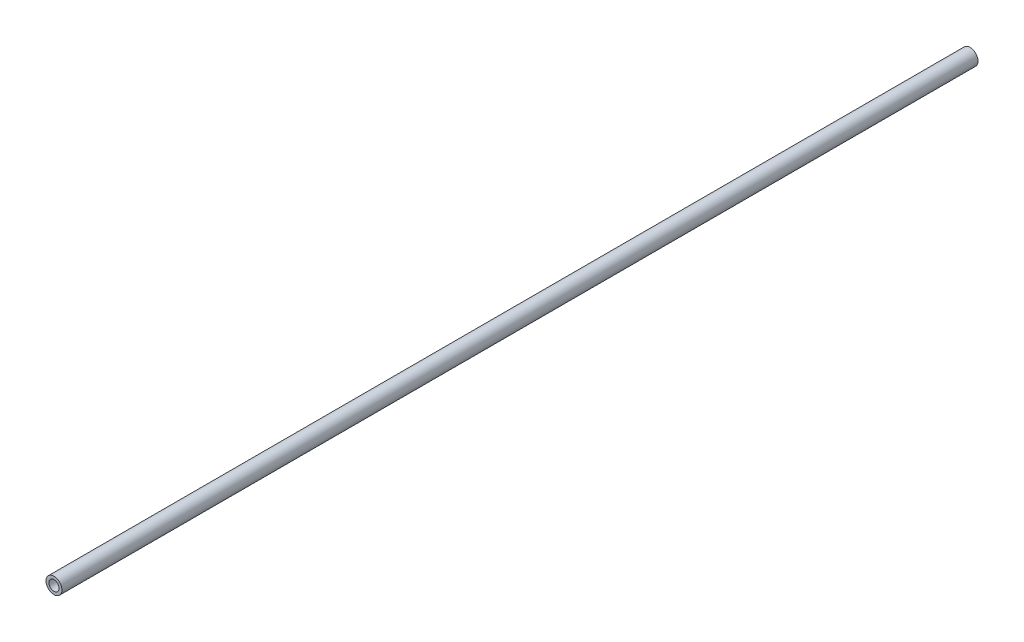
ISO-10303-21;
HEADER;
FILE_DESCRIPTION(('STEP AP214'),'2;1');
FILE_NAME('part.step','',(''),(''),'','','');
FILE_SCHEMA(('AUTOMOTIVE_DESIGN { 1 0 10303 214 1 1 1 1 }'));
ENDSEC;
DATA;
#1=APPLICATION_CONTEXT('core data for automotive mechanical design processes');
#2=APPLICATION_PROTOCOL_DEFINITION('international standard','automotive_design',2000,#1);
#3=PRODUCT_CONTEXT('',#1,'mechanical');
#4=PRODUCT('Part','Part','',(#3));
#5=PRODUCT_RELATED_PRODUCT_CATEGORY('part','',(#4));
#6=PRODUCT_DEFINITION_FORMATION('','',#4);
#7=PRODUCT_DEFINITION_CONTEXT('part definition',#1,'design');
#8=PRODUCT_DEFINITION('design','',#6,#7);
#9=PRODUCT_DEFINITION_SHAPE('','',#8);
#10=(LENGTH_UNIT() NAMED_UNIT(*) SI_UNIT(.MILLI.,.METRE.));
#11=(NAMED_UNIT(*) PLANE_ANGLE_UNIT() SI_UNIT($,.RADIAN.));
#12=(NAMED_UNIT(*) SI_UNIT($,.STERADIAN.) SOLID_ANGLE_UNIT());
#13=UNCERTAINTY_MEASURE_WITH_UNIT(LENGTH_MEASURE(1.E-05),#10,'distance_accuracy_value','');
#14=(GEOMETRIC_REPRESENTATION_CONTEXT(3) GLOBAL_UNCERTAINTY_ASSIGNED_CONTEXT((#13)) GLOBAL_UNIT_ASSIGNED_CONTEXT((#10,
#11,#12)) REPRESENTATION_CONTEXT('',''));
#15=CARTESIAN_POINT('',(0.,0.,0.));
#16=DIRECTION('',(0.,0.,1.));
#17=DIRECTION('',(1.,0.,0.));
#18=AXIS2_PLACEMENT_3D('',#15,#16,#17);
#19=CARTESIAN_POINT('',(0.,0.,316.));
#20=DIRECTION('',(0.,0.,1.));
#21=DIRECTION('',(1.,0.,0.));
#22=AXIS2_PLACEMENT_3D('',#19,#20,#21);
#23=PLANE('',#22);
#24=CARTESIAN_POINT('',(0.,0.,316.));
#25=DIRECTION('',(0.,0.,1.));
#26=DIRECTION('',(1.,0.,0.));
#27=AXIS2_PLACEMENT_3D('',#24,#25,#26);
#28=CIRCLE('',#27,2.75);
#29=CARTESIAN_POINT('',(2.75,0.,316.));
#30=VERTEX_POINT('',#29);
#31=EDGE_CURVE('E10',#30,#30,#28,.T.);
#32=ORIENTED_EDGE('',*,*,#31,.T.);
#33=EDGE_LOOP('',(#32));
#34=FACE_BOUND('',#33,.T.);
#35=CARTESIAN_POINT('',(0.,0.,316.));
#36=DIRECTION('',(0.,0.,1.));
#37=DIRECTION('',(1.,0.,0.));
#38=AXIS2_PLACEMENT_3D('',#35,#36,#37);
#39=CIRCLE('',#38,1.75);
#40=CARTESIAN_POINT('',(1.75,0.,316.));
#41=VERTEX_POINT('',#40);
#42=EDGE_CURVE('E41',#41,#41,#39,.T.);
#43=ORIENTED_EDGE('',*,*,#42,.F.);
#44=EDGE_LOOP('',(#43));
#45=FACE_BOUND('',#44,.T.);
#46=ADVANCED_FACE('F30',(#34,#45),#23,.T.);
#47=CARTESIAN_POINT('',(0.,0.,0.));
#48=DIRECTION('',(0.,0.,1.));
#49=DIRECTION('',(1.,0.,0.));
#50=AXIS2_PLACEMENT_3D('',#47,#48,#49);
#51=PLANE('',#50);
#52=CARTESIAN_POINT('',(0.,0.,0.));
#53=DIRECTION('',(0.,0.,1.));
#54=DIRECTION('',(1.,0.,0.));
#55=AXIS2_PLACEMENT_3D('',#52,#53,#54);
#56=CIRCLE('',#55,2.75);
#57=CARTESIAN_POINT('',(2.75,0.,0.));
#58=VERTEX_POINT('',#57);
#59=EDGE_CURVE('E34',#58,#58,#56,.T.);
#60=ORIENTED_EDGE('',*,*,#59,.F.);
#61=EDGE_LOOP('',(#60));
#62=FACE_BOUND('',#61,.T.);
#63=CARTESIAN_POINT('',(0.,0.,0.));
#64=DIRECTION('',(0.,0.,1.));
#65=DIRECTION('',(1.,0.,0.));
#66=AXIS2_PLACEMENT_3D('',#63,#64,#65);
#67=CIRCLE('',#66,1.75);
#68=CARTESIAN_POINT('',(1.75,0.,0.));
#69=VERTEX_POINT('',#68);
#70=EDGE_CURVE('E43',#69,#69,#67,.T.);
#71=ORIENTED_EDGE('',*,*,#70,.T.);
#72=EDGE_LOOP('',(#71));
#73=FACE_BOUND('',#72,.T.);
#74=ADVANCED_FACE('F53',(#62,#73),#51,.F.);
#75=CARTESIAN_POINT('',(0.,0.,316.));
#76=DIRECTION('',(0.,0.,-1.));
#77=DIRECTION('',(-1.,0.,0.));
#78=AXIS2_PLACEMENT_3D('',#75,#76,#77);
#79=CYLINDRICAL_SURFACE('',#78,2.75);
#80=ORIENTED_EDGE('',*,*,#31,.F.);
#81=EDGE_LOOP('',(#80));
#82=FACE_BOUND('',#81,.T.);
#83=ORIENTED_EDGE('',*,*,#59,.T.);
#84=EDGE_LOOP('',(#83));
#85=FACE_BOUND('',#84,.T.);
#86=ADVANCED_FACE('F32',(#82,#85),#79,.T.);
#87=CARTESIAN_POINT('',(0.,0.,316.));
#88=DIRECTION('',(0.,0.,-1.));
#89=DIRECTION('',(-1.,0.,0.));
#90=AXIS2_PLACEMENT_3D('',#87,#88,#89);
#91=CYLINDRICAL_SURFACE('',#90,1.75);
#92=ORIENTED_EDGE('',*,*,#42,.T.);
#93=EDGE_LOOP('',(#92));
#94=FACE_BOUND('',#93,.T.);
#95=ORIENTED_EDGE('',*,*,#70,.F.);
#96=EDGE_LOOP('',(#95));
#97=FACE_BOUND('',#96,.T.);
#98=ADVANCED_FACE('F49',(#94,#97),#91,.F.);
#99=CLOSED_SHELL('',(#46,#74,#86,#98));
#100=MANIFOLD_SOLID_BREP('B2',#99);
#101=ADVANCED_BREP_SHAPE_REPRESENTATION('',(#18,#100),#14);
#102=SHAPE_DEFINITION_REPRESENTATION(#9,#101);
ENDSEC;
END-ISO-10303-21;
